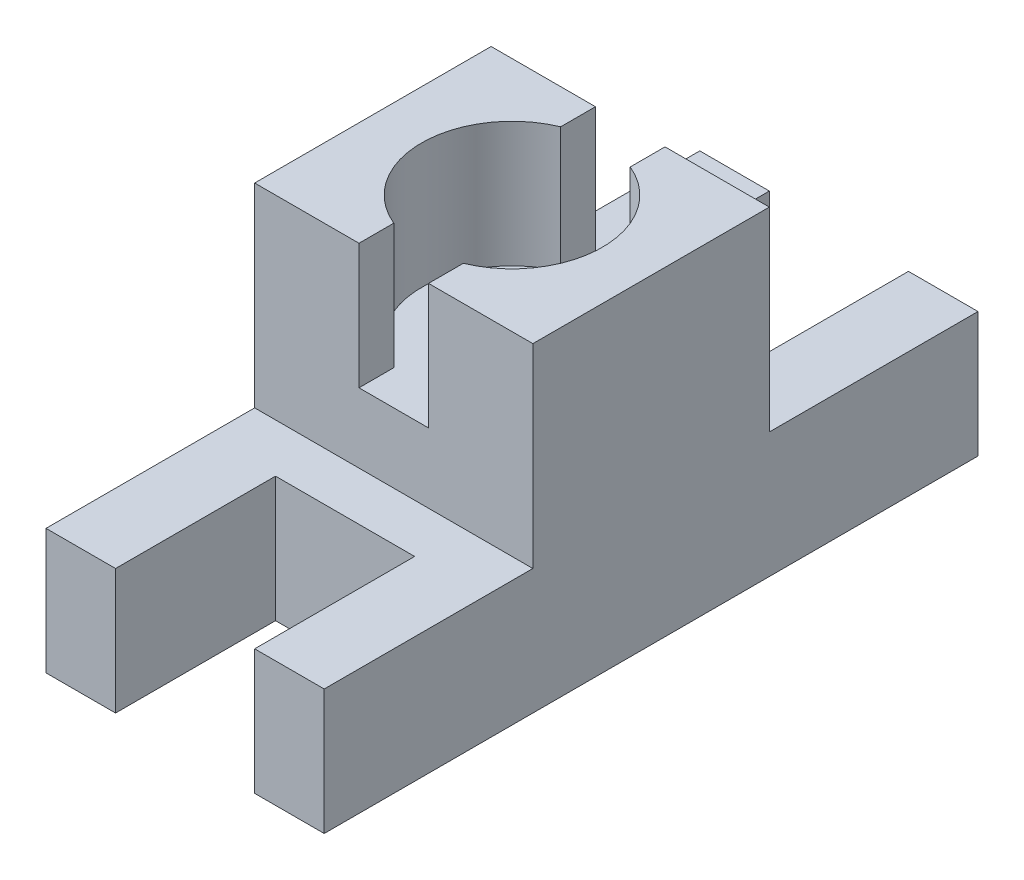
ISO-10303-21;
HEADER;
FILE_DESCRIPTION(('STEP AP214'),'2;1');
FILE_NAME('part.step','',(''),(''),'','','');
FILE_SCHEMA(('AUTOMOTIVE_DESIGN { 1 0 10303 214 1 1 1 1 }'));
ENDSEC;
DATA;
#1=APPLICATION_CONTEXT('core data for automotive mechanical design processes');
#2=APPLICATION_PROTOCOL_DEFINITION('international standard','automotive_design',2000,#1);
#3=PRODUCT_CONTEXT('',#1,'mechanical');
#4=PRODUCT('Part','Part','',(#3));
#5=PRODUCT_RELATED_PRODUCT_CATEGORY('part','',(#4));
#6=PRODUCT_DEFINITION_FORMATION('','',#4);
#7=PRODUCT_DEFINITION_CONTEXT('part definition',#1,'design');
#8=PRODUCT_DEFINITION('design','',#6,#7);
#9=PRODUCT_DEFINITION_SHAPE('','',#8);
#10=(LENGTH_UNIT() NAMED_UNIT(*) SI_UNIT(.MILLI.,.METRE.));
#11=(NAMED_UNIT(*) PLANE_ANGLE_UNIT() SI_UNIT($,.RADIAN.));
#12=(NAMED_UNIT(*) SI_UNIT($,.STERADIAN.) SOLID_ANGLE_UNIT());
#13=UNCERTAINTY_MEASURE_WITH_UNIT(LENGTH_MEASURE(1.E-05),#10,'distance_accuracy_value','');
#14=(GEOMETRIC_REPRESENTATION_CONTEXT(3) GLOBAL_UNCERTAINTY_ASSIGNED_CONTEXT((#13)) GLOBAL_UNIT_ASSIGNED_CONTEXT((#10,
#11,#12)) REPRESENTATION_CONTEXT('',''));
#15=CARTESIAN_POINT('',(0.,0.,0.));
#16=DIRECTION('',(0.,0.,1.));
#17=DIRECTION('',(1.,0.,0.));
#18=AXIS2_PLACEMENT_3D('',#15,#16,#17);
#19=CARTESIAN_POINT('',(20.,46.,30.));
#20=DIRECTION('',(0.,-1.,0.));
#21=DIRECTION('',(0.,0.,-1.));
#22=AXIS2_PLACEMENT_3D('',#19,#20,#21);
#23=PLANE('',#22);
#24=DIRECTION('',(-1.,0.,0.));
#25=VECTOR('',#24,1.);
#26=CARTESIAN_POINT('',(20.,46.,30.));
#27=LINE('',#26,#25);
#28=CARTESIAN_POINT('',(20.,46.,30.));
#29=VERTEX_POINT('',#28);
#30=CARTESIAN_POINT('',(5.,46.,30.));
#31=VERTEX_POINT('',#30);
#32=EDGE_CURVE('E373',#29,#31,#27,.T.);
#33=ORIENTED_EDGE('',*,*,#32,.T.);
#34=DIRECTION('',(0.,0.,-1.));
#35=VECTOR('',#34,1.);
#36=CARTESIAN_POINT('',(5.,46.,30.));
#37=LINE('',#36,#35);
#38=CARTESIAN_POINT('',(5.,46.,35.));
#39=VERTEX_POINT('',#38);
#40=EDGE_CURVE('E222',#39,#31,#37,.T.);
#41=ORIENTED_EDGE('',*,*,#40,.F.);
#42=CARTESIAN_POINT('',(0.,46.,47.));
#43=DIRECTION('',(0.,1.,0.));
#44=DIRECTION('',(0.,0.,1.));
#45=AXIS2_PLACEMENT_3D('',#42,#43,#44);
#46=CIRCLE('',#45,13.);
#47=CARTESIAN_POINT('',(4.99999999999999,46.,59.));
#48=VERTEX_POINT('',#47);
#49=EDGE_CURVE('E224',#48,#39,#46,.T.);
#50=ORIENTED_EDGE('',*,*,#49,.F.);
#51=DIRECTION('',(0.,0.,-1.));
#52=VECTOR('',#51,1.);
#53=CARTESIAN_POINT('',(5.,46.,59.));
#54=LINE('',#53,#52);
#55=CARTESIAN_POINT('',(5.,46.,64.));
#56=VERTEX_POINT('',#55);
#57=EDGE_CURVE('E244',#56,#48,#54,.T.);
#58=ORIENTED_EDGE('',*,*,#57,.F.);
#59=DIRECTION('',(-1.,0.,0.));
#60=VECTOR('',#59,1.);
#61=CARTESIAN_POINT('',(20.,46.,64.));
#62=LINE('',#61,#60);
#63=CARTESIAN_POINT('',(20.,46.,64.));
#64=VERTEX_POINT('',#63);
#65=EDGE_CURVE('E369',#64,#56,#62,.T.);
#66=ORIENTED_EDGE('',*,*,#65,.F.);
#67=DIRECTION('',(0.,0.,1.));
#68=VECTOR('',#67,1.);
#69=CARTESIAN_POINT('',(20.,46.,30.));
#70=LINE('',#69,#68);
#71=EDGE_CURVE('E323',#29,#64,#70,.T.);
#72=ORIENTED_EDGE('',*,*,#71,.F.);
#73=EDGE_LOOP('',(#33,#41,#50,#58,#66,#72));
#74=FACE_BOUND('',#73,.T.);
#75=ADVANCED_FACE('F39',(#74),#23,.F.);
#76=CARTESIAN_POINT('',(20.,0.,0.));
#77=DIRECTION('',(0.,0.,1.));
#78=DIRECTION('',(1.,0.,0.));
#79=AXIS2_PLACEMENT_3D('',#76,#77,#78);
#80=PLANE('',#79);
#81=DIRECTION('',(-1.,0.,0.));
#82=VECTOR('',#81,1.);
#83=CARTESIAN_POINT('',(20.,0.,0.));
#84=LINE('',#83,#82);
#85=CARTESIAN_POINT('',(20.,0.,0.));
#86=VERTEX_POINT('',#85);
#87=CARTESIAN_POINT('',(10.,0.,0.));
#88=VERTEX_POINT('',#87);
#89=EDGE_CURVE('E354',#86,#88,#84,.T.);
#90=ORIENTED_EDGE('',*,*,#89,.T.);
#91=DIRECTION('',(0.,1.,0.));
#92=VECTOR('',#91,1.);
#93=CARTESIAN_POINT('',(10.,0.,0.));
#94=LINE('',#93,#92);
#95=CARTESIAN_POINT('',(10.,18.,0.));
#96=VERTEX_POINT('',#95);
#97=EDGE_CURVE('E277',#88,#96,#94,.T.);
#98=ORIENTED_EDGE('',*,*,#97,.T.);
#99=DIRECTION('',(-1.,0.,0.));
#100=VECTOR('',#99,1.);
#101=CARTESIAN_POINT('',(20.,18.,0.));
#102=LINE('',#101,#100);
#103=CARTESIAN_POINT('',(20.,18.,0.));
#104=VERTEX_POINT('',#103);
#105=EDGE_CURVE('E11',#104,#96,#102,.T.);
#106=ORIENTED_EDGE('',*,*,#105,.F.);
#107=DIRECTION('',(0.,1.,0.));
#108=VECTOR('',#107,1.);
#109=CARTESIAN_POINT('',(20.,0.,0.));
#110=LINE('',#109,#108);
#111=EDGE_CURVE('E315',#86,#104,#110,.T.);
#112=ORIENTED_EDGE('',*,*,#111,.F.);
#113=EDGE_LOOP('',(#90,#98,#106,#112));
#114=FACE_BOUND('',#113,.T.);
#115=ADVANCED_FACE('F427',(#114),#80,.F.);
#116=CARTESIAN_POINT('',(20.,0.,94.));
#117=DIRECTION('',(0.,0.,-1.));
#118=DIRECTION('',(-1.,0.,0.));
#119=AXIS2_PLACEMENT_3D('',#116,#117,#118);
#120=PLANE('',#119);
#121=DIRECTION('',(-1.,0.,0.));
#122=VECTOR('',#121,1.);
#123=CARTESIAN_POINT('',(20.,0.,94.));
#124=LINE('',#123,#122);
#125=CARTESIAN_POINT('',(-10.,0.,94.));
#126=VERTEX_POINT('',#125);
#127=CARTESIAN_POINT('',(-20.,0.,94.));
#128=VERTEX_POINT('',#127);
#129=EDGE_CURVE('E357',#126,#128,#124,.T.);
#130=ORIENTED_EDGE('',*,*,#129,.F.);
#131=DIRECTION('',(0.,1.,0.));
#132=VECTOR('',#131,1.);
#133=CARTESIAN_POINT('',(-10.,0.,94.));
#134=LINE('',#133,#132);
#135=CARTESIAN_POINT('',(-10.,18.,94.));
#136=VERTEX_POINT('',#135);
#137=EDGE_CURVE('E273',#126,#136,#134,.T.);
#138=ORIENTED_EDGE('',*,*,#137,.T.);
#139=DIRECTION('',(-1.,0.,0.));
#140=VECTOR('',#139,1.);
#141=CARTESIAN_POINT('',(20.,18.,94.));
#142=LINE('',#141,#140);
#143=CARTESIAN_POINT('',(-20.,18.,94.));
#144=VERTEX_POINT('',#143);
#145=EDGE_CURVE('E361',#136,#144,#142,.T.);
#146=ORIENTED_EDGE('',*,*,#145,.T.);
#147=DIRECTION('',(0.,-1.,0.));
#148=VECTOR('',#147,1.);
#149=CARTESIAN_POINT('',(-20.,0.,94.));
#150=LINE('',#149,#148);
#151=EDGE_CURVE('E349',#144,#128,#150,.T.);
#152=ORIENTED_EDGE('',*,*,#151,.T.);
#153=EDGE_LOOP('',(#130,#138,#146,#152));
#154=FACE_BOUND('',#153,.T.);
#155=ADVANCED_FACE('F402',(#154),#120,.F.);
#156=CARTESIAN_POINT('',(-10.,18.,0.));
#157=VERTEX_POINT('',#156);
#158=CARTESIAN_POINT('',(-20.,18.,0.));
#159=VERTEX_POINT('',#158);
#160=EDGE_CURVE('E47',#157,#159,#102,.T.);
#161=ORIENTED_EDGE('',*,*,#160,.F.);
#162=DIRECTION('',(0.,1.,0.));
#163=VECTOR('',#162,1.);
#164=CARTESIAN_POINT('',(-10.,0.,0.));
#165=LINE('',#164,#163);
#166=CARTESIAN_POINT('',(-10.,0.,0.));
#167=VERTEX_POINT('',#166);
#168=EDGE_CURVE('E301',#167,#157,#165,.T.);
#169=ORIENTED_EDGE('',*,*,#168,.F.);
#170=CARTESIAN_POINT('',(-20.,0.,0.));
#171=VERTEX_POINT('',#170);
#172=EDGE_CURVE('E333',#167,#171,#84,.T.);
#173=ORIENTED_EDGE('',*,*,#172,.T.);
#174=DIRECTION('',(0.,1.,0.));
#175=VECTOR('',#174,1.);
#176=CARTESIAN_POINT('',(-20.,0.,0.));
#177=LINE('',#176,#175);
#178=EDGE_CURVE('E284',#171,#159,#177,.T.);
#179=ORIENTED_EDGE('',*,*,#178,.T.);
#180=EDGE_LOOP('',(#161,#169,#173,#179));
#181=FACE_BOUND('',#180,.T.);
#182=ADVANCED_FACE('F41',(#181),#80,.F.);
#183=CARTESIAN_POINT('',(20.,18.,0.));
#184=DIRECTION('',(0.,-1.,0.));
#185=DIRECTION('',(0.,0.,-1.));
#186=AXIS2_PLACEMENT_3D('',#183,#184,#185);
#187=PLANE('',#186);
#188=ORIENTED_EDGE('',*,*,#105,.T.);
#189=DIRECTION('',(0.,0.,-1.));
#190=VECTOR('',#189,1.);
#191=CARTESIAN_POINT('',(10.,18.,0.));
#192=LINE('',#191,#190);
#193=CARTESIAN_POINT('',(10.,18.,23.));
#194=VERTEX_POINT('',#193);
#195=EDGE_CURVE('E295',#194,#96,#192,.T.);
#196=ORIENTED_EDGE('',*,*,#195,.F.);
#197=DIRECTION('',(1.,0.,0.));
#198=VECTOR('',#197,1.);
#199=CARTESIAN_POINT('',(-10.,18.,23.));
#200=LINE('',#199,#198);
#201=CARTESIAN_POINT('',(-10.,18.,23.));
#202=VERTEX_POINT('',#201);
#203=EDGE_CURVE('E304',#202,#194,#200,.T.);
#204=ORIENTED_EDGE('',*,*,#203,.F.);
#205=DIRECTION('',(0.,0.,1.));
#206=VECTOR('',#205,1.);
#207=CARTESIAN_POINT('',(-10.,18.,0.));
#208=LINE('',#207,#206);
#209=EDGE_CURVE('E251',#157,#202,#208,.T.);
#210=ORIENTED_EDGE('',*,*,#209,.F.);
#211=ORIENTED_EDGE('',*,*,#160,.T.);
#212=DIRECTION('',(0.,0.,1.));
#213=VECTOR('',#212,1.);
#214=CARTESIAN_POINT('',(-20.,18.,0.));
#215=LINE('',#214,#213);
#216=CARTESIAN_POINT('',(-20.,18.,30.));
#217=VERTEX_POINT('',#216);
#218=EDGE_CURVE('E336',#159,#217,#215,.T.);
#219=ORIENTED_EDGE('',*,*,#218,.T.);
#220=DIRECTION('',(-1.,0.,0.));
#221=VECTOR('',#220,1.);
#222=CARTESIAN_POINT('',(20.,18.,30.));
#223=LINE('',#222,#221);
#224=CARTESIAN_POINT('',(20.,18.,30.));
#225=VERTEX_POINT('',#224);
#226=EDGE_CURVE('E375',#225,#217,#223,.T.);
#227=ORIENTED_EDGE('',*,*,#226,.F.);
#228=DIRECTION('',(0.,0.,1.));
#229=VECTOR('',#228,1.);
#230=CARTESIAN_POINT('',(20.,18.,0.));
#231=LINE('',#230,#229);
#232=EDGE_CURVE('E318',#104,#225,#231,.T.);
#233=ORIENTED_EDGE('',*,*,#232,.F.);
#234=EDGE_LOOP('',(#188,#196,#204,#210,#211,#219,#227,#233));
#235=FACE_BOUND('',#234,.T.);
#236=ADVANCED_FACE('F385',(#235),#187,.F.);
#237=CARTESIAN_POINT('',(20.,46.,30.));
#238=DIRECTION('',(0.,0.,1.));
#239=DIRECTION('',(1.,0.,0.));
#240=AXIS2_PLACEMENT_3D('',#237,#238,#239);
#241=PLANE('',#240);
#242=CARTESIAN_POINT('',(-5.,46.,30.));
#243=VERTEX_POINT('',#242);
#244=CARTESIAN_POINT('',(-20.,46.,30.));
#245=VERTEX_POINT('',#244);
#246=EDGE_CURVE('E372',#243,#245,#27,.T.);
#247=ORIENTED_EDGE('',*,*,#246,.F.);
#248=DIRECTION('',(0.,1.,0.));
#249=VECTOR('',#248,1.);
#250=CARTESIAN_POINT('',(-5.,28.,30.));
#251=LINE('',#250,#249);
#252=CARTESIAN_POINT('',(-5.,28.,30.));
#253=VERTEX_POINT('',#252);
#254=EDGE_CURVE('E249',#253,#243,#251,.T.);
#255=ORIENTED_EDGE('',*,*,#254,.F.);
#256=DIRECTION('',(-1.,0.,0.));
#257=VECTOR('',#256,1.);
#258=CARTESIAN_POINT('',(-5.,28.,30.));
#259=LINE('',#258,#257);
#260=CARTESIAN_POINT('',(5.,28.,30.));
#261=VERTEX_POINT('',#260);
#262=EDGE_CURVE('E213',#261,#253,#259,.T.);
#263=ORIENTED_EDGE('',*,*,#262,.F.);
#264=DIRECTION('',(0.,1.,0.));
#265=VECTOR('',#264,1.);
#266=CARTESIAN_POINT('',(5.,28.,30.));
#267=LINE('',#266,#265);
#268=EDGE_CURVE('E252',#261,#31,#267,.T.);
#269=ORIENTED_EDGE('',*,*,#268,.T.);
#270=ORIENTED_EDGE('',*,*,#32,.F.);
#271=DIRECTION('',(0.,1.,0.));
#272=VECTOR('',#271,1.);
#273=CARTESIAN_POINT('',(20.,46.,30.));
#274=LINE('',#273,#272);
#275=EDGE_CURVE('E321',#225,#29,#274,.T.);
#276=ORIENTED_EDGE('',*,*,#275,.F.);
#277=ORIENTED_EDGE('',*,*,#226,.T.);
#278=DIRECTION('',(0.,1.,0.));
#279=VECTOR('',#278,1.);
#280=CARTESIAN_POINT('',(-20.,46.,30.));
#281=LINE('',#280,#279);
#282=EDGE_CURVE('E338',#217,#245,#281,.T.);
#283=ORIENTED_EDGE('',*,*,#282,.T.);
#284=EDGE_LOOP('',(#247,#255,#263,#269,#270,#276,#277,#283));
#285=FACE_BOUND('',#284,.T.);
#286=ADVANCED_FACE('F418',(#285),#241,.F.);
#287=CARTESIAN_POINT('',(0.,46.,47.));
#288=DIRECTION('',(0.,1.,0.));
#289=DIRECTION('',(0.,0.,1.));
#290=AXIS2_PLACEMENT_3D('',#287,#288,#289);
#291=CIRCLE('',#290,13.);
#292=CARTESIAN_POINT('',(-5.00000000000001,46.,35.));
#293=VERTEX_POINT('',#292);
#294=CARTESIAN_POINT('',(-5.,46.,59.));
#295=VERTEX_POINT('',#294);
#296=EDGE_CURVE('E240',#293,#295,#291,.T.);
#297=ORIENTED_EDGE('',*,*,#296,.F.);
#298=DIRECTION('',(0.,0.,1.));
#299=VECTOR('',#298,1.);
#300=CARTESIAN_POINT('',(-5.,46.,30.));
#301=LINE('',#300,#299);
#302=EDGE_CURVE('E208',#243,#293,#301,.T.);
#303=ORIENTED_EDGE('',*,*,#302,.F.);
#304=ORIENTED_EDGE('',*,*,#246,.T.);
#305=DIRECTION('',(0.,0.,1.));
#306=VECTOR('',#305,1.);
#307=CARTESIAN_POINT('',(-20.,46.,30.));
#308=LINE('',#307,#306);
#309=CARTESIAN_POINT('',(-20.,46.,64.));
#310=VERTEX_POINT('',#309);
#311=EDGE_CURVE('E341',#245,#310,#308,.T.);
#312=ORIENTED_EDGE('',*,*,#311,.T.);
#313=CARTESIAN_POINT('',(-5.,46.,64.));
#314=VERTEX_POINT('',#313);
#315=EDGE_CURVE('E368',#314,#310,#62,.T.);
#316=ORIENTED_EDGE('',*,*,#315,.F.);
#317=DIRECTION('',(0.,0.,1.));
#318=VECTOR('',#317,1.);
#319=CARTESIAN_POINT('',(-5.,46.,59.));
#320=LINE('',#319,#318);
#321=EDGE_CURVE('E242',#295,#314,#320,.T.);
#322=ORIENTED_EDGE('',*,*,#321,.F.);
#323=EDGE_LOOP('',(#297,#303,#304,#312,#316,#322));
#324=FACE_BOUND('',#323,.T.);
#325=ADVANCED_FACE('F415',(#324),#23,.F.);
#326=CARTESIAN_POINT('',(20.,46.,64.));
#327=DIRECTION('',(0.,0.,-1.));
#328=DIRECTION('',(-1.,0.,0.));
#329=AXIS2_PLACEMENT_3D('',#326,#327,#328);
#330=PLANE('',#329);
#331=ORIENTED_EDGE('',*,*,#65,.T.);
#332=DIRECTION('',(0.,1.,0.));
#333=VECTOR('',#332,1.);
#334=CARTESIAN_POINT('',(5.,28.,64.));
#335=LINE('',#334,#333);
#336=CARTESIAN_POINT('',(5.,28.,64.));
#337=VERTEX_POINT('',#336);
#338=EDGE_CURVE('E259',#337,#56,#335,.T.);
#339=ORIENTED_EDGE('',*,*,#338,.F.);
#340=DIRECTION('',(1.,0.,0.));
#341=VECTOR('',#340,1.);
#342=CARTESIAN_POINT('',(-5.,28.,64.));
#343=LINE('',#342,#341);
#344=CARTESIAN_POINT('',(-5.,28.,64.));
#345=VERTEX_POINT('',#344);
#346=EDGE_CURVE('E228',#345,#337,#343,.T.);
#347=ORIENTED_EDGE('',*,*,#346,.F.);
#348=DIRECTION('',(0.,1.,0.));
#349=VECTOR('',#348,1.);
#350=CARTESIAN_POINT('',(-5.,28.,64.));
#351=LINE('',#350,#349);
#352=EDGE_CURVE('E261',#345,#314,#351,.T.);
#353=ORIENTED_EDGE('',*,*,#352,.T.);
#354=ORIENTED_EDGE('',*,*,#315,.T.);
#355=DIRECTION('',(0.,-1.,0.));
#356=VECTOR('',#355,1.);
#357=CARTESIAN_POINT('',(-20.,46.,64.));
#358=LINE('',#357,#356);
#359=CARTESIAN_POINT('',(-20.,18.,64.));
#360=VERTEX_POINT('',#359);
#361=EDGE_CURVE('E344',#310,#360,#358,.T.);
#362=ORIENTED_EDGE('',*,*,#361,.T.);
#363=DIRECTION('',(-1.,0.,0.));
#364=VECTOR('',#363,1.);
#365=CARTESIAN_POINT('',(20.,18.,64.));
#366=LINE('',#365,#364);
#367=CARTESIAN_POINT('',(20.,18.,64.));
#368=VERTEX_POINT('',#367);
#369=EDGE_CURVE('E365',#368,#360,#366,.T.);
#370=ORIENTED_EDGE('',*,*,#369,.F.);
#371=DIRECTION('',(0.,-1.,0.));
#372=VECTOR('',#371,1.);
#373=CARTESIAN_POINT('',(20.,46.,64.));
#374=LINE('',#373,#372);
#375=EDGE_CURVE('E325',#64,#368,#374,.T.);
#376=ORIENTED_EDGE('',*,*,#375,.F.);
#377=EDGE_LOOP('',(#331,#339,#347,#353,#354,#362,#370,#376));
#378=FACE_BOUND('',#377,.T.);
#379=ADVANCED_FACE('F412',(#378),#330,.F.);
#380=CARTESIAN_POINT('',(20.,18.,94.));
#381=DIRECTION('',(0.,-1.,0.));
#382=DIRECTION('',(0.,0.,-1.));
#383=AXIS2_PLACEMENT_3D('',#380,#381,#382);
#384=PLANE('',#383);
#385=ORIENTED_EDGE('',*,*,#145,.F.);
#386=DIRECTION('',(0.,0.,1.));
#387=VECTOR('',#386,1.);
#388=CARTESIAN_POINT('',(-10.,18.,94.));
#389=LINE('',#388,#387);
#390=CARTESIAN_POINT('',(-10.,18.,71.));
#391=VERTEX_POINT('',#390);
#392=EDGE_CURVE('E274',#391,#136,#389,.T.);
#393=ORIENTED_EDGE('',*,*,#392,.F.);
#394=DIRECTION('',(-1.,0.,0.));
#395=VECTOR('',#394,1.);
#396=CARTESIAN_POINT('',(-10.,18.,71.));
#397=LINE('',#396,#395);
#398=CARTESIAN_POINT('',(10.,18.,71.));
#399=VERTEX_POINT('',#398);
#400=EDGE_CURVE('E269',#399,#391,#397,.T.);
#401=ORIENTED_EDGE('',*,*,#400,.F.);
#402=DIRECTION('',(0.,0.,-1.));
#403=VECTOR('',#402,1.);
#404=CARTESIAN_POINT('',(10.,18.,94.));
#405=LINE('',#404,#403);
#406=CARTESIAN_POINT('',(10.,18.,94.));
#407=VERTEX_POINT('',#406);
#408=EDGE_CURVE('E276',#407,#399,#405,.T.);
#409=ORIENTED_EDGE('',*,*,#408,.F.);
#410=CARTESIAN_POINT('',(20.,18.,94.));
#411=VERTEX_POINT('',#410);
#412=EDGE_CURVE('E362',#411,#407,#142,.T.);
#413=ORIENTED_EDGE('',*,*,#412,.F.);
#414=DIRECTION('',(0.,0.,1.));
#415=VECTOR('',#414,1.);
#416=CARTESIAN_POINT('',(20.,18.,94.));
#417=LINE('',#416,#415);
#418=EDGE_CURVE('E327',#368,#411,#417,.T.);
#419=ORIENTED_EDGE('',*,*,#418,.F.);
#420=ORIENTED_EDGE('',*,*,#369,.T.);
#421=DIRECTION('',(0.,0.,1.));
#422=VECTOR('',#421,1.);
#423=CARTESIAN_POINT('',(-20.,18.,94.));
#424=LINE('',#423,#422);
#425=EDGE_CURVE('E346',#360,#144,#424,.T.);
#426=ORIENTED_EDGE('',*,*,#425,.T.);
#427=EDGE_LOOP('',(#385,#393,#401,#409,#413,#419,#420,#426));
#428=FACE_BOUND('',#427,.T.);
#429=ADVANCED_FACE('F406',(#428),#384,.F.);
#430=ORIENTED_EDGE('',*,*,#412,.T.);
#431=DIRECTION('',(0.,1.,0.));
#432=VECTOR('',#431,1.);
#433=CARTESIAN_POINT('',(10.,0.,94.));
#434=LINE('',#433,#432);
#435=CARTESIAN_POINT('',(10.,0.,94.));
#436=VERTEX_POINT('',#435);
#437=EDGE_CURVE('E287',#436,#407,#434,.T.);
#438=ORIENTED_EDGE('',*,*,#437,.F.);
#439=CARTESIAN_POINT('',(20.,0.,94.));
#440=VERTEX_POINT('',#439);
#441=EDGE_CURVE('E358',#440,#436,#124,.T.);
#442=ORIENTED_EDGE('',*,*,#441,.F.);
#443=DIRECTION('',(0.,-1.,0.));
#444=VECTOR('',#443,1.);
#445=CARTESIAN_POINT('',(20.,0.,94.));
#446=LINE('',#445,#444);
#447=EDGE_CURVE('E329',#411,#440,#446,.T.);
#448=ORIENTED_EDGE('',*,*,#447,.F.);
#449=EDGE_LOOP('',(#430,#438,#442,#448));
#450=FACE_BOUND('',#449,.T.);
#451=ADVANCED_FACE('F439',(#450),#120,.F.);
#452=CARTESIAN_POINT('',(20.,0.,0.));
#453=DIRECTION('',(0.,1.,0.));
#454=DIRECTION('',(0.,0.,1.));
#455=AXIS2_PLACEMENT_3D('',#452,#453,#454);
#456=PLANE('',#455);
#457=DIRECTION('',(-1.,0.,0.));
#458=VECTOR('',#457,1.);
#459=CARTESIAN_POINT('',(-10.,0.,71.));
#460=LINE('',#459,#458);
#461=CARTESIAN_POINT('',(10.,0.,71.));
#462=VERTEX_POINT('',#461);
#463=CARTESIAN_POINT('',(-10.,0.,71.));
#464=VERTEX_POINT('',#463);
#465=EDGE_CURVE('E62',#462,#464,#460,.T.);
#466=ORIENTED_EDGE('',*,*,#465,.T.);
#467=DIRECTION('',(0.,0.,1.));
#468=VECTOR('',#467,1.);
#469=CARTESIAN_POINT('',(-10.,0.,94.));
#470=LINE('',#469,#468);
#471=EDGE_CURVE('E265',#464,#126,#470,.T.);
#472=ORIENTED_EDGE('',*,*,#471,.T.);
#473=ORIENTED_EDGE('',*,*,#129,.T.);
#474=DIRECTION('',(0.,0.,-1.));
#475=VECTOR('',#474,1.);
#476=CARTESIAN_POINT('',(-20.,0.,0.));
#477=LINE('',#476,#475);
#478=EDGE_CURVE('E319',#128,#171,#477,.T.);
#479=ORIENTED_EDGE('',*,*,#478,.T.);
#480=ORIENTED_EDGE('',*,*,#172,.F.);
#481=DIRECTION('',(0.,0.,1.));
#482=VECTOR('',#481,1.);
#483=CARTESIAN_POINT('',(-10.,0.,0.));
#484=LINE('',#483,#482);
#485=CARTESIAN_POINT('',(-10.,0.,23.));
#486=VERTEX_POINT('',#485);
#487=EDGE_CURVE('E291',#167,#486,#484,.T.);
#488=ORIENTED_EDGE('',*,*,#487,.T.);
#489=DIRECTION('',(1.,0.,0.));
#490=VECTOR('',#489,1.);
#491=CARTESIAN_POINT('',(-10.,0.,23.));
#492=LINE('',#491,#490);
#493=CARTESIAN_POINT('',(10.,0.,23.));
#494=VERTEX_POINT('',#493);
#495=EDGE_CURVE('E294',#486,#494,#492,.T.);
#496=ORIENTED_EDGE('',*,*,#495,.T.);
#497=DIRECTION('',(0.,0.,-1.));
#498=VECTOR('',#497,1.);
#499=CARTESIAN_POINT('',(10.,0.,0.));
#500=LINE('',#499,#498);
#501=EDGE_CURVE('E298',#494,#88,#500,.T.);
#502=ORIENTED_EDGE('',*,*,#501,.T.);
#503=ORIENTED_EDGE('',*,*,#89,.F.);
#504=DIRECTION('',(0.,0.,-1.));
#505=VECTOR('',#504,1.);
#506=CARTESIAN_POINT('',(20.,0.,0.));
#507=LINE('',#506,#505);
#508=EDGE_CURVE('E331',#440,#86,#507,.T.);
#509=ORIENTED_EDGE('',*,*,#508,.F.);
#510=ORIENTED_EDGE('',*,*,#441,.T.);
#511=DIRECTION('',(0.,0.,-1.));
#512=VECTOR('',#511,1.);
#513=CARTESIAN_POINT('',(10.,0.,94.));
#514=LINE('',#513,#512);
#515=EDGE_CURVE('E268',#436,#462,#514,.T.);
#516=ORIENTED_EDGE('',*,*,#515,.T.);
#517=EDGE_LOOP('',(#466,#472,#473,#479,#480,#488,#496,#502,#503,#509,#510,#516));
#518=FACE_BOUND('',#517,.T.);
#519=ADVANCED_FACE('F396',(#518),#456,.F.);
#520=CARTESIAN_POINT('',(20.,0.,0.));
#521=DIRECTION('',(1.,0.,0.));
#522=DIRECTION('',(0.,0.,-1.));
#523=AXIS2_PLACEMENT_3D('',#520,#521,#522);
#524=PLANE('',#523);
#525=ORIENTED_EDGE('',*,*,#111,.T.);
#526=ORIENTED_EDGE('',*,*,#232,.T.);
#527=ORIENTED_EDGE('',*,*,#275,.T.);
#528=ORIENTED_EDGE('',*,*,#71,.T.);
#529=ORIENTED_EDGE('',*,*,#375,.T.);
#530=ORIENTED_EDGE('',*,*,#418,.T.);
#531=ORIENTED_EDGE('',*,*,#447,.T.);
#532=ORIENTED_EDGE('',*,*,#508,.T.);
#533=EDGE_LOOP('',(#525,#526,#527,#528,#529,#530,#531,#532));
#534=FACE_BOUND('',#533,.T.);
#535=ADVANCED_FACE('F445',(#534),#524,.T.);
#536=CARTESIAN_POINT('',(-20.,0.,0.));
#537=DIRECTION('',(1.,0.,0.));
#538=DIRECTION('',(0.,0.,-1.));
#539=AXIS2_PLACEMENT_3D('',#536,#537,#538);
#540=PLANE('',#539);
#541=ORIENTED_EDGE('',*,*,#178,.F.);
#542=ORIENTED_EDGE('',*,*,#478,.F.);
#543=ORIENTED_EDGE('',*,*,#151,.F.);
#544=ORIENTED_EDGE('',*,*,#425,.F.);
#545=ORIENTED_EDGE('',*,*,#361,.F.);
#546=ORIENTED_EDGE('',*,*,#311,.F.);
#547=ORIENTED_EDGE('',*,*,#282,.F.);
#548=ORIENTED_EDGE('',*,*,#218,.F.);
#549=EDGE_LOOP('',(#541,#542,#543,#544,#545,#546,#547,#548));
#550=FACE_BOUND('',#549,.T.);
#551=ADVANCED_FACE('F391',(#550),#540,.F.);
#552=CARTESIAN_POINT('',(10.,0.,0.));
#553=DIRECTION('',(1.,0.,0.));
#554=DIRECTION('',(0.,0.,-1.));
#555=AXIS2_PLACEMENT_3D('',#552,#553,#554);
#556=PLANE('',#555);
#557=ORIENTED_EDGE('',*,*,#195,.T.);
#558=ORIENTED_EDGE('',*,*,#97,.F.);
#559=ORIENTED_EDGE('',*,*,#501,.F.);
#560=DIRECTION('',(0.,1.,0.));
#561=VECTOR('',#560,1.);
#562=CARTESIAN_POINT('',(10.,0.,23.));
#563=LINE('',#562,#561);
#564=EDGE_CURVE('E310',#494,#194,#563,.T.);
#565=ORIENTED_EDGE('',*,*,#564,.T.);
#566=EDGE_LOOP('',(#557,#558,#559,#565));
#567=FACE_BOUND('',#566,.T.);
#568=ADVANCED_FACE('F448',(#567),#556,.F.);
#569=CARTESIAN_POINT('',(-10.,0.,23.));
#570=DIRECTION('',(0.,0.,1.));
#571=DIRECTION('',(1.,0.,0.));
#572=AXIS2_PLACEMENT_3D('',#569,#570,#571);
#573=PLANE('',#572);
#574=ORIENTED_EDGE('',*,*,#203,.T.);
#575=ORIENTED_EDGE('',*,*,#564,.F.);
#576=ORIENTED_EDGE('',*,*,#495,.F.);
#577=DIRECTION('',(0.,1.,0.));
#578=VECTOR('',#577,1.);
#579=CARTESIAN_POINT('',(-10.,0.,23.));
#580=LINE('',#579,#578);
#581=EDGE_CURVE('E312',#486,#202,#580,.T.);
#582=ORIENTED_EDGE('',*,*,#581,.T.);
#583=EDGE_LOOP('',(#574,#575,#576,#582));
#584=FACE_BOUND('',#583,.T.);
#585=ADVANCED_FACE('F456',(#584),#573,.F.);
#586=CARTESIAN_POINT('',(-10.,0.,0.));
#587=DIRECTION('',(-1.,0.,0.));
#588=DIRECTION('',(0.,0.,1.));
#589=AXIS2_PLACEMENT_3D('',#586,#587,#588);
#590=PLANE('',#589);
#591=ORIENTED_EDGE('',*,*,#209,.T.);
#592=ORIENTED_EDGE('',*,*,#581,.F.);
#593=ORIENTED_EDGE('',*,*,#487,.F.);
#594=ORIENTED_EDGE('',*,*,#168,.T.);
#595=EDGE_LOOP('',(#591,#592,#593,#594));
#596=FACE_BOUND('',#595,.T.);
#597=ADVANCED_FACE('F452',(#596),#590,.F.);
#598=CARTESIAN_POINT('',(-10.,0.,94.));
#599=DIRECTION('',(-1.,0.,0.));
#600=DIRECTION('',(0.,0.,1.));
#601=AXIS2_PLACEMENT_3D('',#598,#599,#600);
#602=PLANE('',#601);
#603=ORIENTED_EDGE('',*,*,#392,.T.);
#604=ORIENTED_EDGE('',*,*,#137,.F.);
#605=ORIENTED_EDGE('',*,*,#471,.F.);
#606=DIRECTION('',(0.,1.,0.));
#607=VECTOR('',#606,1.);
#608=CARTESIAN_POINT('',(-10.,0.,71.));
#609=LINE('',#608,#607);
#610=EDGE_CURVE('E282',#464,#391,#609,.T.);
#611=ORIENTED_EDGE('',*,*,#610,.T.);
#612=EDGE_LOOP('',(#603,#604,#605,#611));
#613=FACE_BOUND('',#612,.T.);
#614=ADVANCED_FACE('F455',(#613),#602,.F.);
#615=CARTESIAN_POINT('',(-10.,0.,71.));
#616=DIRECTION('',(0.,0.,-1.));
#617=DIRECTION('',(-1.,0.,0.));
#618=AXIS2_PLACEMENT_3D('',#615,#616,#617);
#619=PLANE('',#618);
#620=ORIENTED_EDGE('',*,*,#400,.T.);
#621=ORIENTED_EDGE('',*,*,#610,.F.);
#622=ORIENTED_EDGE('',*,*,#465,.F.);
#623=DIRECTION('',(0.,1.,0.));
#624=VECTOR('',#623,1.);
#625=CARTESIAN_POINT('',(10.,0.,71.));
#626=LINE('',#625,#624);
#627=EDGE_CURVE('E285',#462,#399,#626,.T.);
#628=ORIENTED_EDGE('',*,*,#627,.T.);
#629=EDGE_LOOP('',(#620,#621,#622,#628));
#630=FACE_BOUND('',#629,.T.);
#631=ADVANCED_FACE('F466',(#630),#619,.F.);
#632=CARTESIAN_POINT('',(10.,0.,94.));
#633=DIRECTION('',(1.,0.,0.));
#634=DIRECTION('',(0.,0.,-1.));
#635=AXIS2_PLACEMENT_3D('',#632,#633,#634);
#636=PLANE('',#635);
#637=ORIENTED_EDGE('',*,*,#408,.T.);
#638=ORIENTED_EDGE('',*,*,#627,.F.);
#639=ORIENTED_EDGE('',*,*,#515,.F.);
#640=ORIENTED_EDGE('',*,*,#437,.T.);
#641=EDGE_LOOP('',(#637,#638,#639,#640));
#642=FACE_BOUND('',#641,.T.);
#643=ADVANCED_FACE('F468',(#642),#636,.F.);
#644=CARTESIAN_POINT('',(-5.,28.,30.));
#645=DIRECTION('',(-1.,0.,0.));
#646=DIRECTION('',(0.,0.,1.));
#647=AXIS2_PLACEMENT_3D('',#644,#645,#646);
#648=PLANE('',#647);
#649=ORIENTED_EDGE('',*,*,#302,.T.);
#650=DIRECTION('',(0.,1.,0.));
#651=VECTOR('',#650,1.);
#652=CARTESIAN_POINT('',(-5.00000000000001,28.,35.));
#653=LINE('',#652,#651);
#654=CARTESIAN_POINT('',(-5.00000000000001,28.,35.));
#655=VERTEX_POINT('',#654);
#656=EDGE_CURVE('E201',#655,#293,#653,.T.);
#657=ORIENTED_EDGE('',*,*,#656,.F.);
#658=DIRECTION('',(0.,0.,1.));
#659=VECTOR('',#658,1.);
#660=CARTESIAN_POINT('',(-5.,28.,30.));
#661=LINE('',#660,#659);
#662=EDGE_CURVE('E205',#253,#655,#661,.T.);
#663=ORIENTED_EDGE('',*,*,#662,.F.);
#664=ORIENTED_EDGE('',*,*,#254,.T.);
#665=EDGE_LOOP('',(#649,#657,#663,#664));
#666=FACE_BOUND('',#665,.T.);
#667=ADVANCED_FACE('F203',(#666),#648,.F.);
#668=CARTESIAN_POINT('',(5.,28.,30.));
#669=DIRECTION('',(1.,0.,0.));
#670=DIRECTION('',(0.,0.,-1.));
#671=AXIS2_PLACEMENT_3D('',#668,#669,#670);
#672=PLANE('',#671);
#673=ORIENTED_EDGE('',*,*,#40,.T.);
#674=ORIENTED_EDGE('',*,*,#268,.F.);
#675=DIRECTION('',(0.,0.,-1.));
#676=VECTOR('',#675,1.);
#677=CARTESIAN_POINT('',(5.,28.,30.));
#678=LINE('',#677,#676);
#679=CARTESIAN_POINT('',(5.,28.,35.));
#680=VERTEX_POINT('',#679);
#681=EDGE_CURVE('E236',#680,#261,#678,.T.);
#682=ORIENTED_EDGE('',*,*,#681,.F.);
#683=DIRECTION('',(0.,1.,0.));
#684=VECTOR('',#683,1.);
#685=CARTESIAN_POINT('',(5.,28.,35.));
#686=LINE('',#685,#684);
#687=EDGE_CURVE('E255',#680,#39,#686,.T.);
#688=ORIENTED_EDGE('',*,*,#687,.T.);
#689=EDGE_LOOP('',(#673,#674,#682,#688));
#690=FACE_BOUND('',#689,.T.);
#691=ADVANCED_FACE('F475',(#690),#672,.F.);
#692=CARTESIAN_POINT('',(0.,28.,47.));
#693=DIRECTION('',(0.,1.,0.));
#694=DIRECTION('',(0.,0.,1.));
#695=AXIS2_PLACEMENT_3D('',#692,#693,#694);
#696=CYLINDRICAL_SURFACE('',#695,13.);
#697=ORIENTED_EDGE('',*,*,#49,.T.);
#698=ORIENTED_EDGE('',*,*,#687,.F.);
#699=CARTESIAN_POINT('',(0.,28.,47.));
#700=DIRECTION('',(0.,1.,0.));
#701=DIRECTION('',(0.,0.,1.));
#702=AXIS2_PLACEMENT_3D('',#699,#700,#701);
#703=CIRCLE('',#702,13.);
#704=CARTESIAN_POINT('',(4.99999999999999,28.,59.));
#705=VERTEX_POINT('',#704);
#706=EDGE_CURVE('E233',#705,#680,#703,.T.);
#707=ORIENTED_EDGE('',*,*,#706,.F.);
#708=DIRECTION('',(0.,1.,0.));
#709=VECTOR('',#708,1.);
#710=CARTESIAN_POINT('',(4.99999999999999,28.,59.));
#711=LINE('',#710,#709);
#712=EDGE_CURVE('E257',#705,#48,#711,.T.);
#713=ORIENTED_EDGE('',*,*,#712,.T.);
#714=EDGE_LOOP('',(#697,#698,#707,#713));
#715=FACE_BOUND('',#714,.T.);
#716=ADVANCED_FACE('F485',(#715),#696,.F.);
#717=CARTESIAN_POINT('',(5.,28.,59.));
#718=DIRECTION('',(1.,0.,0.));
#719=DIRECTION('',(0.,0.,-1.));
#720=AXIS2_PLACEMENT_3D('',#717,#718,#719);
#721=PLANE('',#720);
#722=ORIENTED_EDGE('',*,*,#57,.T.);
#723=ORIENTED_EDGE('',*,*,#712,.F.);
#724=DIRECTION('',(0.,0.,-1.));
#725=VECTOR('',#724,1.);
#726=CARTESIAN_POINT('',(5.,28.,59.));
#727=LINE('',#726,#725);
#728=EDGE_CURVE('E230',#337,#705,#727,.T.);
#729=ORIENTED_EDGE('',*,*,#728,.F.);
#730=ORIENTED_EDGE('',*,*,#338,.T.);
#731=EDGE_LOOP('',(#722,#723,#729,#730));
#732=FACE_BOUND('',#731,.T.);
#733=ADVANCED_FACE('F481',(#732),#721,.F.);
#734=CARTESIAN_POINT('',(-5.,28.,59.));
#735=DIRECTION('',(-1.,0.,0.));
#736=DIRECTION('',(0.,0.,1.));
#737=AXIS2_PLACEMENT_3D('',#734,#735,#736);
#738=PLANE('',#737);
#739=ORIENTED_EDGE('',*,*,#321,.T.);
#740=ORIENTED_EDGE('',*,*,#352,.F.);
#741=DIRECTION('',(0.,0.,1.));
#742=VECTOR('',#741,1.);
#743=CARTESIAN_POINT('',(-5.,28.,59.));
#744=LINE('',#743,#742);
#745=CARTESIAN_POINT('',(-5.,28.,59.));
#746=VERTEX_POINT('',#745);
#747=EDGE_CURVE('E54',#746,#345,#744,.T.);
#748=ORIENTED_EDGE('',*,*,#747,.F.);
#749=DIRECTION('',(0.,1.,0.));
#750=VECTOR('',#749,1.);
#751=CARTESIAN_POINT('',(-5.,28.,59.));
#752=LINE('',#751,#750);
#753=EDGE_CURVE('E212',#746,#295,#752,.T.);
#754=ORIENTED_EDGE('',*,*,#753,.T.);
#755=EDGE_LOOP('',(#739,#740,#748,#754));
#756=FACE_BOUND('',#755,.T.);
#757=ADVANCED_FACE('F478',(#756),#738,.F.);
#758=CARTESIAN_POINT('',(0.,28.,47.));
#759=DIRECTION('',(0.,1.,0.));
#760=DIRECTION('',(0.,0.,1.));
#761=AXIS2_PLACEMENT_3D('',#758,#759,#760);
#762=CYLINDRICAL_SURFACE('',#761,13.);
#763=ORIENTED_EDGE('',*,*,#296,.T.);
#764=ORIENTED_EDGE('',*,*,#753,.F.);
#765=CARTESIAN_POINT('',(0.,28.,47.));
#766=DIRECTION('',(0.,1.,0.));
#767=DIRECTION('',(0.,0.,1.));
#768=AXIS2_PLACEMENT_3D('',#765,#766,#767);
#769=CIRCLE('',#768,13.);
#770=EDGE_CURVE('E215',#655,#746,#769,.T.);
#771=ORIENTED_EDGE('',*,*,#770,.F.);
#772=ORIENTED_EDGE('',*,*,#656,.T.);
#773=EDGE_LOOP('',(#763,#764,#771,#772));
#774=FACE_BOUND('',#773,.T.);
#775=ADVANCED_FACE('F216',(#774),#762,.F.);
#776=CARTESIAN_POINT('',(0.,28.,47.));
#777=DIRECTION('',(0.,1.,0.));
#778=DIRECTION('',(0.,0.,1.));
#779=AXIS2_PLACEMENT_3D('',#776,#777,#778);
#780=PLANE('',#779);
#781=ORIENTED_EDGE('',*,*,#662,.T.);
#782=ORIENTED_EDGE('',*,*,#770,.T.);
#783=ORIENTED_EDGE('',*,*,#747,.T.);
#784=ORIENTED_EDGE('',*,*,#346,.T.);
#785=ORIENTED_EDGE('',*,*,#728,.T.);
#786=ORIENTED_EDGE('',*,*,#706,.T.);
#787=ORIENTED_EDGE('',*,*,#681,.T.);
#788=ORIENTED_EDGE('',*,*,#262,.T.);
#789=EDGE_LOOP('',(#781,#782,#783,#784,#785,#786,#787,#788));
#790=FACE_BOUND('',#789,.T.);
#791=ADVANCED_FACE('F218',(#790),#780,.T.);
#792=CLOSED_SHELL('',(#75,#115,#155,#182,#236,#286,#325,#379,#429,#451,#519,#535,#551,#568,#585,
#597,#614,#631,#643,#667,#691,#716,#733,#757,#775,#791));
#793=MANIFOLD_SOLID_BREP('B2',#792);
#794=ADVANCED_BREP_SHAPE_REPRESENTATION('',(#18,#793),#14);
#795=SHAPE_DEFINITION_REPRESENTATION(#9,#794);
ENDSEC;
END-ISO-10303-21;
